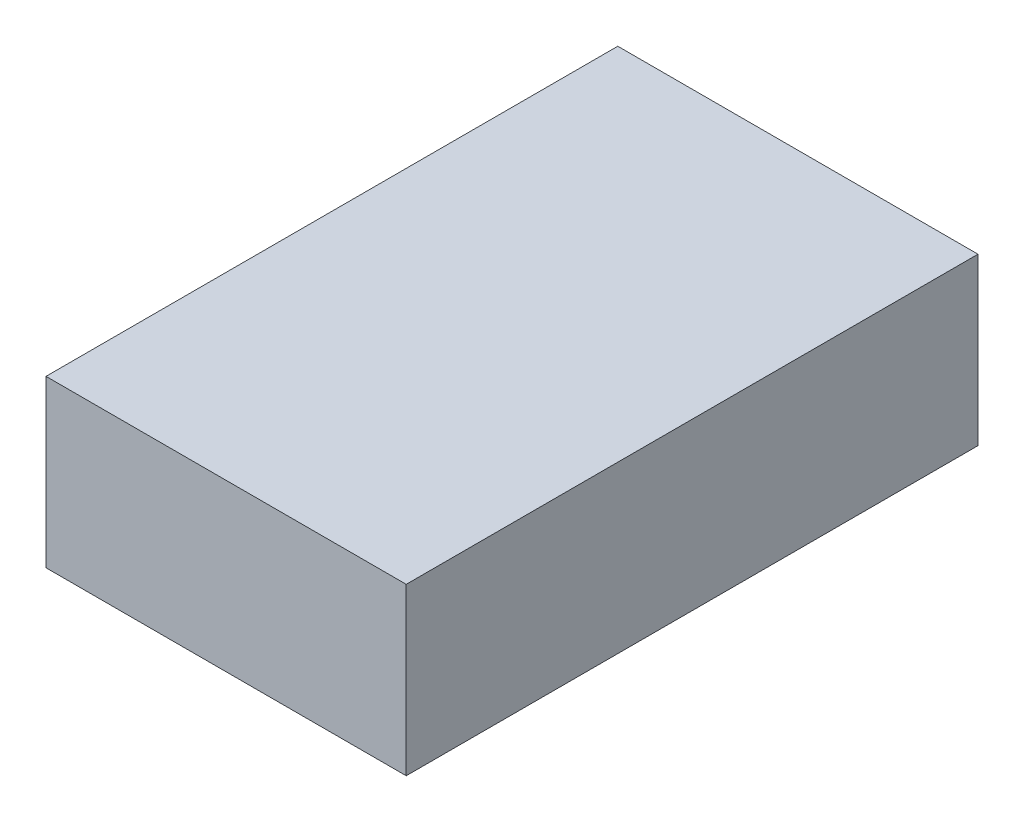
ISO-10303-21;
HEADER;
FILE_DESCRIPTION(('STEP AP214'),'2;1');
FILE_NAME('part.step','',(''),(''),'','','');
FILE_SCHEMA(('AUTOMOTIVE_DESIGN { 1 0 10303 214 1 1 1 1 }'));
ENDSEC;
DATA;
#1=APPLICATION_CONTEXT('core data for automotive mechanical design processes');
#2=APPLICATION_PROTOCOL_DEFINITION('international standard','automotive_design',2000,#1);
#3=PRODUCT_CONTEXT('',#1,'mechanical');
#4=PRODUCT('Part','Part','',(#3));
#5=PRODUCT_RELATED_PRODUCT_CATEGORY('part','',(#4));
#6=PRODUCT_DEFINITION_FORMATION('','',#4);
#7=PRODUCT_DEFINITION_CONTEXT('part definition',#1,'design');
#8=PRODUCT_DEFINITION('design','',#6,#7);
#9=PRODUCT_DEFINITION_SHAPE('','',#8);
#10=(LENGTH_UNIT() NAMED_UNIT(*) SI_UNIT(.MILLI.,.METRE.));
#11=(NAMED_UNIT(*) PLANE_ANGLE_UNIT() SI_UNIT($,.RADIAN.));
#12=(NAMED_UNIT(*) SI_UNIT($,.STERADIAN.) SOLID_ANGLE_UNIT());
#13=UNCERTAINTY_MEASURE_WITH_UNIT(LENGTH_MEASURE(1.E-05),#10,'distance_accuracy_value','');
#14=(GEOMETRIC_REPRESENTATION_CONTEXT(3) GLOBAL_UNCERTAINTY_ASSIGNED_CONTEXT((#13)) GLOBAL_UNIT_ASSIGNED_CONTEXT((#10,
#11,#12)) REPRESENTATION_CONTEXT('',''));
#15=CARTESIAN_POINT('',(0.,0.,0.));
#16=DIRECTION('',(0.,0.,1.));
#17=DIRECTION('',(1.,0.,0.));
#18=AXIS2_PLACEMENT_3D('',#15,#16,#17);
#19=CARTESIAN_POINT('',(-13.3871895940087,8.54237288135593,50.));
#20=DIRECTION('',(1.,0.,0.));
#21=DIRECTION('',(0.,0.,-1.));
#22=AXIS2_PLACEMENT_3D('',#19,#20,#21);
#23=PLANE('',#22);
#24=DIRECTION('',(0.,-1.,0.));
#25=VECTOR('',#24,1.);
#26=CARTESIAN_POINT('',(-13.3871895940087,8.54237288135593,0.));
#27=LINE('',#26,#25);
#28=CARTESIAN_POINT('',(-13.3871895940087,8.54237288135593,0.));
#29=VERTEX_POINT('',#28);
#30=CARTESIAN_POINT('',(-13.3871895940087,-5.95762711864407,0.));
#31=VERTEX_POINT('',#30);
#32=EDGE_CURVE('E109',#29,#31,#27,.T.);
#33=ORIENTED_EDGE('',*,*,#32,.T.);
#34=DIRECTION('',(0.,0.,-1.));
#35=VECTOR('',#34,1.);
#36=CARTESIAN_POINT('',(-13.3871895940087,-5.95762711864407,50.));
#37=LINE('',#36,#35);
#38=CARTESIAN_POINT('',(-13.3871895940087,-5.95762711864407,50.));
#39=VERTEX_POINT('',#38);
#40=EDGE_CURVE('E11',#39,#31,#37,.T.);
#41=ORIENTED_EDGE('',*,*,#40,.F.);
#42=DIRECTION('',(0.,-1.,0.));
#43=VECTOR('',#42,1.);
#44=CARTESIAN_POINT('',(-13.3871895940087,8.54237288135593,50.));
#45=LINE('',#44,#43);
#46=CARTESIAN_POINT('',(-13.3871895940087,8.54237288135593,50.));
#47=VERTEX_POINT('',#46);
#48=EDGE_CURVE('E93',#47,#39,#45,.T.);
#49=ORIENTED_EDGE('',*,*,#48,.F.);
#50=DIRECTION('',(0.,0.,-1.));
#51=VECTOR('',#50,1.);
#52=CARTESIAN_POINT('',(-13.3871895940087,8.54237288135593,50.));
#53=LINE('',#52,#51);
#54=EDGE_CURVE('E105',#47,#29,#53,.T.);
#55=ORIENTED_EDGE('',*,*,#54,.T.);
#56=EDGE_LOOP('',(#33,#41,#49,#55));
#57=FACE_BOUND('',#56,.T.);
#58=ADVANCED_FACE('F41',(#57),#23,.F.);
#59=CARTESIAN_POINT('',(-13.3871895940087,-5.95762711864407,50.));
#60=DIRECTION('',(0.,1.,0.));
#61=DIRECTION('',(0.,0.,1.));
#62=AXIS2_PLACEMENT_3D('',#59,#60,#61);
#63=PLANE('',#62);
#64=DIRECTION('',(1.,0.,0.));
#65=VECTOR('',#64,1.);
#66=CARTESIAN_POINT('',(-13.3871895940087,-5.95762711864407,0.));
#67=LINE('',#66,#65);
#68=CARTESIAN_POINT('',(18.1128104059914,-5.95762711864407,0.));
#69=VERTEX_POINT('',#68);
#70=EDGE_CURVE('E98',#31,#69,#67,.T.);
#71=ORIENTED_EDGE('',*,*,#70,.T.);
#72=DIRECTION('',(0.,0.,-1.));
#73=VECTOR('',#72,1.);
#74=CARTESIAN_POINT('',(18.1128104059914,-5.95762711864407,50.));
#75=LINE('',#74,#73);
#76=CARTESIAN_POINT('',(18.1128104059914,-5.95762711864407,50.));
#77=VERTEX_POINT('',#76);
#78=EDGE_CURVE('E50',#77,#69,#75,.T.);
#79=ORIENTED_EDGE('',*,*,#78,.F.);
#80=DIRECTION('',(1.,0.,0.));
#81=VECTOR('',#80,1.);
#82=CARTESIAN_POINT('',(-13.3871895940087,-5.95762711864407,50.));
#83=LINE('',#82,#81);
#84=EDGE_CURVE('E88',#39,#77,#83,.T.);
#85=ORIENTED_EDGE('',*,*,#84,.F.);
#86=ORIENTED_EDGE('',*,*,#40,.T.);
#87=EDGE_LOOP('',(#71,#79,#85,#86));
#88=FACE_BOUND('',#87,.T.);
#89=ADVANCED_FACE('F97',(#88),#63,.F.);
#90=CARTESIAN_POINT('',(18.1128104059913,8.54237288135593,50.));
#91=DIRECTION('',(-1.,0.,0.));
#92=DIRECTION('',(0.,-1.,0.));
#93=AXIS2_PLACEMENT_3D('',#90,#91,#92);
#94=PLANE('',#93);
#95=DIRECTION('',(0.,1.,0.));
#96=VECTOR('',#95,1.);
#97=CARTESIAN_POINT('',(18.1128104059913,8.54237288135593,0.));
#98=LINE('',#97,#96);
#99=CARTESIAN_POINT('',(18.1128104059913,8.54237288135593,0.));
#100=VERTEX_POINT('',#99);
#101=EDGE_CURVE('E75',#69,#100,#98,.T.);
#102=ORIENTED_EDGE('',*,*,#101,.T.);
#103=DIRECTION('',(0.,0.,-1.));
#104=VECTOR('',#103,1.);
#105=CARTESIAN_POINT('',(18.1128104059913,8.54237288135593,50.));
#106=LINE('',#105,#104);
#107=CARTESIAN_POINT('',(18.1128104059913,8.54237288135593,50.));
#108=VERTEX_POINT('',#107);
#109=EDGE_CURVE('E100',#108,#100,#106,.T.);
#110=ORIENTED_EDGE('',*,*,#109,.F.);
#111=DIRECTION('',(0.,1.,0.));
#112=VECTOR('',#111,1.);
#113=CARTESIAN_POINT('',(18.1128104059913,8.54237288135593,50.));
#114=LINE('',#113,#112);
#115=EDGE_CURVE('E91',#77,#108,#114,.T.);
#116=ORIENTED_EDGE('',*,*,#115,.F.);
#117=ORIENTED_EDGE('',*,*,#78,.T.);
#118=EDGE_LOOP('',(#102,#110,#116,#117));
#119=FACE_BOUND('',#118,.T.);
#120=ADVANCED_FACE('F101',(#119),#94,.F.);
#121=CARTESIAN_POINT('',(-13.3871895940087,8.54237288135593,50.));
#122=DIRECTION('',(0.,-1.,0.));
#123=DIRECTION('',(0.,0.,-1.));
#124=AXIS2_PLACEMENT_3D('',#121,#122,#123);
#125=PLANE('',#124);
#126=DIRECTION('',(-1.,0.,0.));
#127=VECTOR('',#126,1.);
#128=CARTESIAN_POINT('',(-13.3871895940087,8.54237288135593,0.));
#129=LINE('',#128,#127);
#130=EDGE_CURVE('E81',#100,#29,#129,.T.);
#131=ORIENTED_EDGE('',*,*,#130,.T.);
#132=ORIENTED_EDGE('',*,*,#54,.F.);
#133=DIRECTION('',(-1.,0.,0.));
#134=VECTOR('',#133,1.);
#135=CARTESIAN_POINT('',(-13.3871895940087,8.54237288135593,50.));
#136=LINE('',#135,#134);
#137=EDGE_CURVE('E58',#108,#47,#136,.T.);
#138=ORIENTED_EDGE('',*,*,#137,.F.);
#139=ORIENTED_EDGE('',*,*,#109,.T.);
#140=EDGE_LOOP('',(#131,#132,#138,#139));
#141=FACE_BOUND('',#140,.T.);
#142=ADVANCED_FACE('F122',(#141),#125,.F.);
#143=CARTESIAN_POINT('',(0.,0.,50.));
#144=DIRECTION('',(0.,0.,1.));
#145=DIRECTION('',(1.,0.,0.));
#146=AXIS2_PLACEMENT_3D('',#143,#144,#145);
#147=PLANE('',#146);
#148=ORIENTED_EDGE('',*,*,#48,.T.);
#149=ORIENTED_EDGE('',*,*,#84,.T.);
#150=ORIENTED_EDGE('',*,*,#115,.T.);
#151=ORIENTED_EDGE('',*,*,#137,.T.);
#152=EDGE_LOOP('',(#148,#149,#150,#151));
#153=FACE_BOUND('',#152,.T.);
#154=ADVANCED_FACE('F89',(#153),#147,.T.);
#155=CARTESIAN_POINT('',(0.,0.,0.));
#156=DIRECTION('',(0.,0.,1.));
#157=DIRECTION('',(1.,0.,0.));
#158=AXIS2_PLACEMENT_3D('',#155,#156,#157);
#159=PLANE('',#158);
#160=ORIENTED_EDGE('',*,*,#32,.F.);
#161=ORIENTED_EDGE('',*,*,#130,.F.);
#162=ORIENTED_EDGE('',*,*,#101,.F.);
#163=ORIENTED_EDGE('',*,*,#70,.F.);
#164=EDGE_LOOP('',(#160,#161,#162,#163));
#165=FACE_BOUND('',#164,.T.);
#166=ADVANCED_FACE('F125',(#165),#159,.F.);
#167=CLOSED_SHELL('',(#58,#89,#120,#142,#154,#166));
#168=MANIFOLD_SOLID_BREP('B2',#167);
#169=ADVANCED_BREP_SHAPE_REPRESENTATION('',(#18,#168),#14);
#170=SHAPE_DEFINITION_REPRESENTATION(#9,#169);
ENDSEC;
END-ISO-10303-21;
